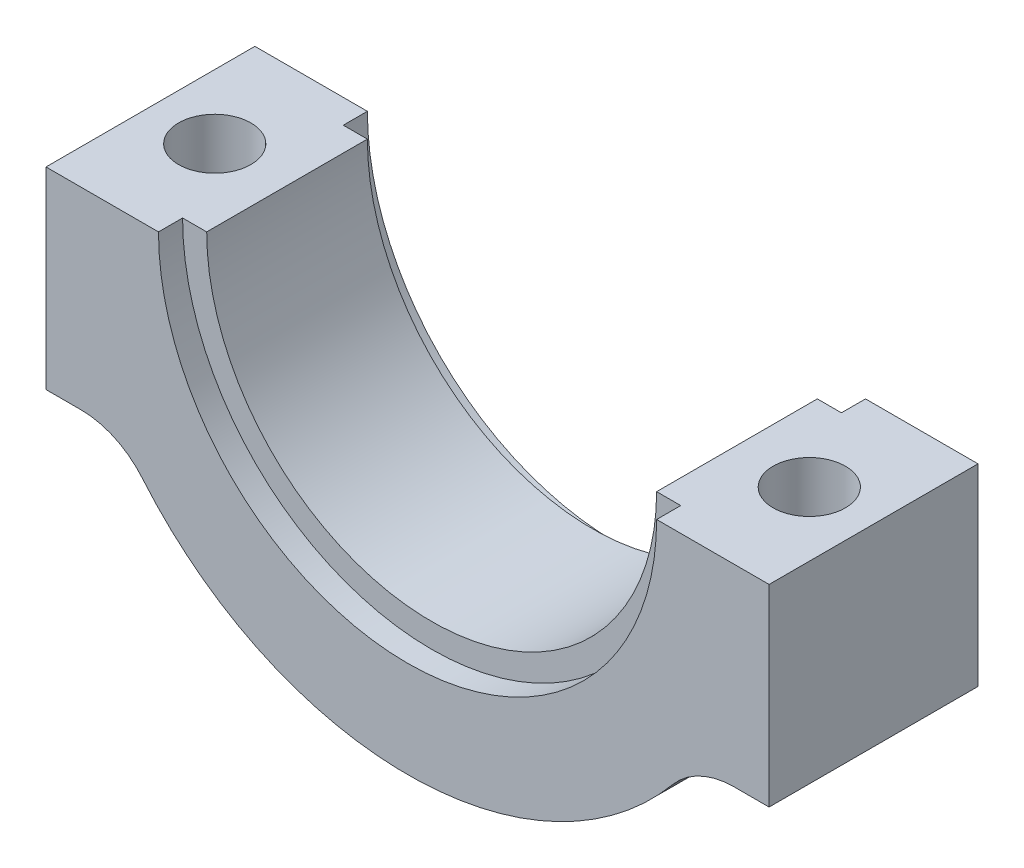
ISO-10303-21;
HEADER;
FILE_DESCRIPTION(('STEP AP214'),'2;1');
FILE_NAME('part.step','',(''),(''),'','','');
FILE_SCHEMA(('AUTOMOTIVE_DESIGN { 1 0 10303 214 1 1 1 1 }'));
ENDSEC;
DATA;
#1=APPLICATION_CONTEXT('core data for automotive mechanical design processes');
#2=APPLICATION_PROTOCOL_DEFINITION('international standard','automotive_design',2000,#1);
#3=PRODUCT_CONTEXT('',#1,'mechanical');
#4=PRODUCT('Part','Part','',(#3));
#5=PRODUCT_RELATED_PRODUCT_CATEGORY('part','',(#4));
#6=PRODUCT_DEFINITION_FORMATION('','',#4);
#7=PRODUCT_DEFINITION_CONTEXT('part definition',#1,'design');
#8=PRODUCT_DEFINITION('design','',#6,#7);
#9=PRODUCT_DEFINITION_SHAPE('','',#8);
#10=(LENGTH_UNIT() NAMED_UNIT(*) SI_UNIT(.MILLI.,.METRE.));
#11=(NAMED_UNIT(*) PLANE_ANGLE_UNIT() SI_UNIT($,.RADIAN.));
#12=(NAMED_UNIT(*) SI_UNIT($,.STERADIAN.) SOLID_ANGLE_UNIT());
#13=UNCERTAINTY_MEASURE_WITH_UNIT(LENGTH_MEASURE(1.E-05),#10,'distance_accuracy_value','');
#14=(GEOMETRIC_REPRESENTATION_CONTEXT(3) GLOBAL_UNCERTAINTY_ASSIGNED_CONTEXT((#13)) GLOBAL_UNIT_ASSIGNED_CONTEXT((#10,
#11,#12)) REPRESENTATION_CONTEXT('',''));
#15=CARTESIAN_POINT('',(0.,0.,0.));
#16=DIRECTION('',(0.,0.,1.));
#17=DIRECTION('',(1.,0.,0.));
#18=AXIS2_PLACEMENT_3D('',#15,#16,#17);
#19=CARTESIAN_POINT('',(-40.6571027005122,-34.,13.));
#20=DIRECTION('',(0.,0.,-1.));
#21=DIRECTION('',(-1.,0.,0.));
#22=AXIS2_PLACEMENT_3D('',#19,#20,#21);
#23=CYLINDRICAL_SURFACE('',#22,10.);
#24=DIRECTION('',(0.,0.,-1.));
#25=VECTOR('',#24,1.);
#26=CARTESIAN_POINT('',(-32.9859512475854,-27.5849056603774,13.));
#27=LINE('',#26,#25);
#28=CARTESIAN_POINT('',(-32.9859512475854,-27.5849056603774,-5.73475479974852));
#29=VERTEX_POINT('',#28);
#30=CARTESIAN_POINT('',(-32.9859512475854,-27.5849056603774,-13.));
#31=VERTEX_POINT('',#30);
#32=EDGE_CURVE('E193',#29,#31,#27,.T.);
#33=ORIENTED_EDGE('',*,*,#32,.F.);
#34=CARTESIAN_POINT('',(-32.9859512475854,-27.5849056603774,-5.73475479974852));
#35=CARTESIAN_POINT('',(-33.1306130932674,-27.4119293618595,-5.83600584331512));
#36=CARTESIAN_POINT('',(-33.2821591027048,-27.2425928465577,-5.93392719494627));
#37=CARTESIAN_POINT('',(-33.5993440803177,-26.9119347154642,-6.12123781025899));
#38=CARTESIAN_POINT('',(-33.7650090613763,-26.7506288005746,-6.21061065214667));
#39=CARTESIAN_POINT('',(-34.1119280376004,-26.4358697395075,-6.37938951398592));
#40=CARTESIAN_POINT('',(-34.2933206619334,-26.2825106258346,-6.45868759261752));
#41=CARTESIAN_POINT('',(-34.6698386747148,-25.9868930346017,-6.60386331383972));
#42=CARTESIAN_POINT('',(-34.8649532144519,-25.8446259710849,-6.66975140154596));
#43=CARTESIAN_POINT('',(-35.2187037793178,-25.6061039553941,-6.77141332626987));
#44=CARTESIAN_POINT('',(-35.3745304059622,-25.5071296205137,-6.81060892107759));
#45=CARTESIAN_POINT('',(-35.6930688560436,-25.3171007419695,-6.87884051703382));
#46=CARTESIAN_POINT('',(-35.855778982955,-25.22604426356,-6.90787900536525));
#47=CARTESIAN_POINT('',(-36.1867131477594,-25.0529136229983,-6.95459420154392));
#48=CARTESIAN_POINT('',(-36.3549139661041,-24.9708067446886,-6.97231352806404));
#49=CARTESIAN_POINT('',(-36.696385675352,-24.8158907428924,-6.99550547242811));
#50=CARTESIAN_POINT('',(-36.8696564395766,-24.7430813873398,-7.00097839599843));
#51=CARTESIAN_POINT('',(-37.2214601983275,-24.6067982069484,-6.99872516743415));
#52=CARTESIAN_POINT('',(-37.4000253428333,-24.5434087205774,-6.9908867722758));
#53=CARTESIAN_POINT('',(-37.7594149154626,-24.4271702152558,-6.96101984607776));
#54=CARTESIAN_POINT('',(-37.9402394728761,-24.3743218024576,-6.9389904993116));
#55=CARTESIAN_POINT('',(-38.3025250594597,-24.279348117569,-6.88019932115076));
#56=CARTESIAN_POINT('',(-38.4839865610824,-24.2372343128925,-6.84342184182186));
#57=CARTESIAN_POINT('',(-38.8454063672415,-24.1637537332521,-6.75492889420727));
#58=CARTESIAN_POINT('',(-39.0253650605597,-24.1323840890544,-6.70321742086251));
#59=CARTESIAN_POINT('',(-39.3299045894253,-24.0876404367327,-6.60221754415596));
#60=CARTESIAN_POINT('',(-39.4553479995582,-24.071686184018,-6.5566104598422));
#61=CARTESIAN_POINT('',(-39.7038759614562,-24.0447513838039,-6.45808923400032));
#62=CARTESIAN_POINT('',(-39.826960675982,-24.033770491928,-6.4051755987399));
#63=CARTESIAN_POINT('',(-40.069979944105,-24.0165086932862,-6.29230806443946));
#64=CARTESIAN_POINT('',(-40.1899186322987,-24.010221285258,-6.23236403743769));
#65=CARTESIAN_POINT('',(-40.4262841485862,-24.0019626171123,-6.10562043200864));
#66=CARTESIAN_POINT('',(-40.5427107098446,-23.9999916841304,-6.03882033437721));
#67=CARTESIAN_POINT('',(-40.6571027005122,-24.,-5.96871844183542));
#68=B_SPLINE_CURVE_WITH_KNOTS('',3,(#34,#35,#36,#37,#38,#39,#40,#41,#42,#43,#44,#45,#46,#47,#48,
#49,#50,#51,#52,#53,#54,#55,#56,#57,#58,#59,#60,#61,#62,#63,#64,#65,#66,#67),.UNSPECIFIED.,.F.,
.F.,(4,2,2,2,2,2,2,2,2,2,2,2,2,2,2,2,4),(0.,0.741583711127663,1.48456454702788,2.23493319059234,
2.98471511205514,3.55035896166155,4.11586420424848,4.67922746929971,5.24257667006354,
5.81069973657776,6.37885546294475,6.94761561066858,7.51622375204728,7.91921385871509,
8.32217605637311,8.72457904276722,9.12701252529948),.UNSPECIFIED.);
#69=CARTESIAN_POINT('',(-40.6571027005122,-24.,-5.96871844183542));
#70=VERTEX_POINT('',#69);
#71=EDGE_CURVE('E57',#29,#70,#68,.T.);
#72=ORIENTED_EDGE('',*,*,#71,.T.);
#73=DIRECTION('',(0.,0.,-1.));
#74=VECTOR('',#73,1.);
#75=CARTESIAN_POINT('',(-40.6571027005122,-24.,13.));
#76=LINE('',#75,#74);
#77=CARTESIAN_POINT('',(-40.6571027005122,-24.,-13.));
#78=VERTEX_POINT('',#77);
#79=EDGE_CURVE('E197',#70,#78,#76,.T.);
#80=ORIENTED_EDGE('',*,*,#79,.T.);
#81=CARTESIAN_POINT('',(-40.6571027005122,-34.,-13.));
#82=DIRECTION('',(0.,0.,-1.));
#83=DIRECTION('',(1.,0.,0.));
#84=AXIS2_PLACEMENT_3D('',#81,#82,#83);
#85=CIRCLE('',#84,10.);
#86=EDGE_CURVE('E273',#78,#31,#85,.T.);
#87=ORIENTED_EDGE('',*,*,#86,.T.);
#88=EDGE_LOOP('',(#33,#72,#80,#87));
#89=FACE_BOUND('',#88,.T.);
#90=ADVANCED_FACE('F37',(#89),#23,.F.);
#91=CARTESIAN_POINT('',(40.6571027005122,-34.,13.));
#92=DIRECTION('',(0.,0.,-1.));
#93=DIRECTION('',(-1.,0.,0.));
#94=AXIS2_PLACEMENT_3D('',#91,#92,#93);
#95=CYLINDRICAL_SURFACE('',#94,10.);
#96=DIRECTION('',(0.,0.,-1.));
#97=VECTOR('',#96,1.);
#98=CARTESIAN_POINT('',(40.6571027005122,-24.,13.));
#99=LINE('',#98,#97);
#100=CARTESIAN_POINT('',(40.6571027005122,-24.,-5.96871844183538));
#101=VERTEX_POINT('',#100);
#102=CARTESIAN_POINT('',(40.6571027005122,-24.,-13.));
#103=VERTEX_POINT('',#102);
#104=EDGE_CURVE('E186',#101,#103,#99,.T.);
#105=ORIENTED_EDGE('',*,*,#104,.F.);
#106=CARTESIAN_POINT('',(40.6571027005122,-24.,-5.96871844183539));
#107=CARTESIAN_POINT('',(40.5134366646464,-23.9999774815993,-6.05677774743217));
#108=CARTESIAN_POINT('',(40.3665407108172,-24.0030951834329,-6.13961459206069));
#109=CARTESIAN_POINT('',(40.0673823612371,-24.0162866326034,-6.29439658122048));
#110=CARTESIAN_POINT('',(39.9151187845807,-24.0263619198241,-6.36633931031872));
#111=CARTESIAN_POINT('',(39.6066387507888,-24.0541217549825,-6.49873720380914));
#112=CARTESIAN_POINT('',(39.4504292549536,-24.0717936781745,-6.55921118869458));
#113=CARTESIAN_POINT('',(39.1351082499968,-24.115221399825,-6.66851899427432));
#114=CARTESIAN_POINT('',(38.9759971047794,-24.1409761910658,-6.71735426395222));
#115=CARTESIAN_POINT('',(38.6558642655714,-24.2009378759578,-6.80335515185163));
#116=CARTESIAN_POINT('',(38.4948393588539,-24.2351617552562,-6.84049697324665));
#117=CARTESIAN_POINT('',(38.1725495283507,-24.3121495800016,-6.90304829444939));
#118=CARTESIAN_POINT('',(38.0112845945001,-24.3549138941881,-6.92845728752661));
#119=CARTESIAN_POINT('',(37.6900311566589,-24.4488502816723,-6.96778410169093));
#120=CARTESIAN_POINT('',(37.5300413348367,-24.5000120279347,-6.98171591213612));
#121=CARTESIAN_POINT('',(37.2123459665914,-24.6105410011828,-6.99858669885626));
#122=CARTESIAN_POINT('',(37.0546404032745,-24.6699081674489,-7.00152575647232));
#123=CARTESIAN_POINT('',(36.7429171064265,-24.7963387155715,-6.99701049353366));
#124=CARTESIAN_POINT('',(36.5888920024561,-24.8633848238845,-6.98957909531888));
#125=CARTESIAN_POINT('',(36.2850008347643,-25.0048440593042,-6.96505750561452));
#126=CARTESIAN_POINT('',(36.1351362823831,-25.0792598197762,-6.94796385120747));
#127=CARTESIAN_POINT('',(35.8398768070319,-25.23516732417,-6.9048130629218));
#128=CARTESIAN_POINT('',(35.694497061923,-25.3166801435765,-6.8787285005583));
#129=CARTESIAN_POINT('',(35.4092176509542,-25.4860561230626,-6.8184073876636));
#130=CARTESIAN_POINT('',(35.2693192300017,-25.5739207129993,-6.78416899760659));
#131=CARTESIAN_POINT('',(34.9240140295484,-25.8027970400703,-6.68857256320868));
#132=CARTESIAN_POINT('',(34.7224630054762,-25.9476429127792,-6.6223801020915));
#133=CARTESIAN_POINT('',(34.3337309505764,-26.2491562861442,-6.47566486242957));
#134=CARTESIAN_POINT('',(34.1465643376447,-26.4058353436112,-6.39512796745435));
#135=CARTESIAN_POINT('',(33.7885512268053,-26.728097306123,-6.2230010204157));
#136=CARTESIAN_POINT('',(33.6175872701046,-26.8935999127131,-6.13150350924224));
#137=CARTESIAN_POINT('',(33.2906601112954,-27.2331029310045,-5.93941381789456));
#138=CARTESIAN_POINT('',(33.1346650495444,-27.4070840500422,-5.83884187927741));
#139=CARTESIAN_POINT('',(32.9859512475854,-27.5849056603774,-5.73475479974854));
#140=B_SPLINE_CURVE_WITH_KNOTS('',3,(#106,#107,#108,#109,#110,#111,#112,#113,#114,#115,#116,
#117,#118,#119,#120,#121,#122,#123,#124,#125,#126,#127,#128,#129,#130,#131,#132,#133,#134,#135,
#136,#137,#138,#139),.UNSPECIFIED.,.F.,.F.,(4,2,2,2,2,2,2,2,2,2,2,2,2,2,2,2,4),(0.,
0.505416484689542,1.01094486628257,1.51563634555385,2.02026495945541,2.52591398042446,
3.03158483788661,3.53663842529542,4.0416882755416,4.54562355520787,5.04973955806353,
5.55540727788137,6.06118918596972,6.8305555561635,7.60068328975448,8.36471485396873,
9.1270824111401),.UNSPECIFIED.);
#141=CARTESIAN_POINT('',(32.9859512475854,-27.5849056603774,-5.73475479974854));
#142=VERTEX_POINT('',#141);
#143=EDGE_CURVE('E64',#101,#142,#140,.T.);
#144=ORIENTED_EDGE('',*,*,#143,.T.);
#145=DIRECTION('',(0.,0.,-1.));
#146=VECTOR('',#145,1.);
#147=CARTESIAN_POINT('',(32.9859512475854,-27.5849056603774,13.));
#148=LINE('',#147,#146);
#149=CARTESIAN_POINT('',(32.9859512475854,-27.5849056603774,-13.));
#150=VERTEX_POINT('',#149);
#151=EDGE_CURVE('E185',#142,#150,#148,.T.);
#152=ORIENTED_EDGE('',*,*,#151,.T.);
#153=CARTESIAN_POINT('',(40.6571027005122,-34.,-13.));
#154=DIRECTION('',(0.,0.,-1.));
#155=DIRECTION('',(1.,0.,0.));
#156=AXIS2_PLACEMENT_3D('',#153,#154,#155);
#157=CIRCLE('',#156,10.);
#158=EDGE_CURVE('E279',#150,#103,#157,.T.);
#159=ORIENTED_EDGE('',*,*,#158,.T.);
#160=EDGE_LOOP('',(#105,#144,#152,#159));
#161=FACE_BOUND('',#160,.T.);
#162=ADVANCED_FACE('F380',(#161),#95,.F.);
#163=CARTESIAN_POINT('',(28.,0.,13.));
#164=DIRECTION('',(0.,-1.,0.));
#165=DIRECTION('',(1.,0.,0.));
#166=AXIS2_PLACEMENT_3D('',#163,#164,#165);
#167=PLANE('',#166);
#168=CARTESIAN_POINT('',(37.,0.,0.));
#169=DIRECTION('',(0.,-1.,0.));
#170=DIRECTION('',(1.,0.,0.));
#171=AXIS2_PLACEMENT_3D('',#168,#169,#170);
#172=CIRCLE('',#171,4.5);
#173=CARTESIAN_POINT('',(41.5,0.,0.));
#174=VERTEX_POINT('',#173);
#175=EDGE_CURVE('E547',#174,#174,#172,.T.);
#176=ORIENTED_EDGE('',*,*,#175,.T.);
#177=EDGE_LOOP('',(#176));
#178=FACE_BOUND('',#177,.T.);
#179=DIRECTION('',(1.,0.,0.));
#180=VECTOR('',#179,1.);
#181=CARTESIAN_POINT('',(28.,0.,10.));
#182=LINE('',#181,#180);
#183=CARTESIAN_POINT('',(28.,0.,10.));
#184=VERTEX_POINT('',#183);
#185=CARTESIAN_POINT('',(31.,0.,10.));
#186=VERTEX_POINT('',#185);
#187=EDGE_CURVE('E231',#184,#186,#182,.T.);
#188=ORIENTED_EDGE('',*,*,#187,.T.);
#189=DIRECTION('',(0.,0.,1.));
#190=VECTOR('',#189,1.);
#191=CARTESIAN_POINT('',(31.,0.,10.));
#192=LINE('',#191,#190);
#193=CARTESIAN_POINT('',(31.,0.,13.));
#194=VERTEX_POINT('',#193);
#195=EDGE_CURVE('E316',#186,#194,#192,.T.);
#196=ORIENTED_EDGE('',*,*,#195,.T.);
#197=DIRECTION('',(-1.,0.,0.));
#198=VECTOR('',#197,1.);
#199=CARTESIAN_POINT('',(28.,0.,13.));
#200=LINE('',#199,#198);
#201=CARTESIAN_POINT('',(45.,0.,13.));
#202=VERTEX_POINT('',#201);
#203=EDGE_CURVE('E247',#202,#194,#200,.T.);
#204=ORIENTED_EDGE('',*,*,#203,.F.);
#205=DIRECTION('',(0.,0.,-1.));
#206=VECTOR('',#205,1.);
#207=CARTESIAN_POINT('',(45.,0.,13.));
#208=LINE('',#207,#206);
#209=CARTESIAN_POINT('',(45.,0.,-13.));
#210=VERTEX_POINT('',#209);
#211=EDGE_CURVE('E265',#202,#210,#208,.T.);
#212=ORIENTED_EDGE('',*,*,#211,.T.);
#213=DIRECTION('',(-1.,0.,0.));
#214=VECTOR('',#213,1.);
#215=CARTESIAN_POINT('',(28.,0.,-13.));
#216=LINE('',#215,#214);
#217=CARTESIAN_POINT('',(31.,0.,-13.));
#218=VERTEX_POINT('',#217);
#219=EDGE_CURVE('E239',#210,#218,#216,.T.);
#220=ORIENTED_EDGE('',*,*,#219,.T.);
#221=DIRECTION('',(0.,0.,-1.));
#222=VECTOR('',#221,1.);
#223=CARTESIAN_POINT('',(31.,0.,-10.));
#224=LINE('',#223,#222);
#225=CARTESIAN_POINT('',(31.,0.,-10.));
#226=VERTEX_POINT('',#225);
#227=EDGE_CURVE('E235',#226,#218,#224,.T.);
#228=ORIENTED_EDGE('',*,*,#227,.F.);
#229=DIRECTION('',(-1.,0.,0.));
#230=VECTOR('',#229,1.);
#231=CARTESIAN_POINT('',(28.,0.,-10.));
#232=LINE('',#231,#230);
#233=CARTESIAN_POINT('',(28.,0.,-10.));
#234=VERTEX_POINT('',#233);
#235=EDGE_CURVE('E233',#226,#234,#232,.T.);
#236=ORIENTED_EDGE('',*,*,#235,.T.);
#237=DIRECTION('',(0.,0.,-1.));
#238=VECTOR('',#237,1.);
#239=CARTESIAN_POINT('',(28.,0.,13.));
#240=LINE('',#239,#238);
#241=EDGE_CURVE('E209',#184,#234,#240,.T.);
#242=ORIENTED_EDGE('',*,*,#241,.F.);
#243=EDGE_LOOP('',(#188,#196,#204,#212,#220,#228,#236,#242));
#244=FACE_BOUND('',#243,.T.);
#245=ADVANCED_FACE('F39',(#178,#244),#167,.F.);
#246=CARTESIAN_POINT('',(-28.,0.,13.));
#247=DIRECTION('',(0.,-1.,0.));
#248=DIRECTION('',(1.,0.,0.));
#249=AXIS2_PLACEMENT_3D('',#246,#247,#248);
#250=PLANE('',#249);
#251=CARTESIAN_POINT('',(-37.,0.,0.));
#252=DIRECTION('',(0.,-1.,0.));
#253=DIRECTION('',(1.,0.,0.));
#254=AXIS2_PLACEMENT_3D('',#251,#252,#253);
#255=CIRCLE('',#254,4.5);
#256=CARTESIAN_POINT('',(-32.5,0.,0.));
#257=VERTEX_POINT('',#256);
#258=EDGE_CURVE('E540',#257,#257,#255,.T.);
#259=ORIENTED_EDGE('',*,*,#258,.T.);
#260=EDGE_LOOP('',(#259));
#261=FACE_BOUND('',#260,.T.);
#262=DIRECTION('',(-1.,0.,0.));
#263=VECTOR('',#262,1.);
#264=CARTESIAN_POINT('',(-28.,0.,13.));
#265=LINE('',#264,#263);
#266=CARTESIAN_POINT('',(-31.,0.,13.));
#267=VERTEX_POINT('',#266);
#268=CARTESIAN_POINT('',(-45.,0.,13.));
#269=VERTEX_POINT('',#268);
#270=EDGE_CURVE('E250',#267,#269,#265,.T.);
#271=ORIENTED_EDGE('',*,*,#270,.F.);
#272=DIRECTION('',(0.,0.,1.));
#273=VECTOR('',#272,1.);
#274=CARTESIAN_POINT('',(-31.,0.,10.));
#275=LINE('',#274,#273);
#276=CARTESIAN_POINT('',(-31.,0.,10.));
#277=VERTEX_POINT('',#276);
#278=EDGE_CURVE('E318',#267,#277,#275,.F.);
#279=ORIENTED_EDGE('',*,*,#278,.T.);
#280=DIRECTION('',(1.,0.,0.));
#281=VECTOR('',#280,1.);
#282=CARTESIAN_POINT('',(-28.,0.,10.));
#283=LINE('',#282,#281);
#284=CARTESIAN_POINT('',(-28.,0.,10.));
#285=VERTEX_POINT('',#284);
#286=EDGE_CURVE('E314',#277,#285,#283,.T.);
#287=ORIENTED_EDGE('',*,*,#286,.T.);
#288=DIRECTION('',(0.,0.,-1.));
#289=VECTOR('',#288,1.);
#290=CARTESIAN_POINT('',(-28.,0.,13.));
#291=LINE('',#290,#289);
#292=CARTESIAN_POINT('',(-28.,0.,-10.));
#293=VERTEX_POINT('',#292);
#294=EDGE_CURVE('E207',#285,#293,#291,.T.);
#295=ORIENTED_EDGE('',*,*,#294,.T.);
#296=DIRECTION('',(-1.,0.,0.));
#297=VECTOR('',#296,1.);
#298=CARTESIAN_POINT('',(-28.,0.,-10.));
#299=LINE('',#298,#297);
#300=CARTESIAN_POINT('',(-31.,0.,-10.));
#301=VERTEX_POINT('',#300);
#302=EDGE_CURVE('E213',#293,#301,#299,.T.);
#303=ORIENTED_EDGE('',*,*,#302,.T.);
#304=DIRECTION('',(0.,0.,-1.));
#305=VECTOR('',#304,1.);
#306=CARTESIAN_POINT('',(-31.,0.,-10.));
#307=LINE('',#306,#305);
#308=CARTESIAN_POINT('',(-31.,0.,-13.));
#309=VERTEX_POINT('',#308);
#310=EDGE_CURVE('E303',#309,#301,#307,.F.);
#311=ORIENTED_EDGE('',*,*,#310,.F.);
#312=DIRECTION('',(-1.,0.,0.));
#313=VECTOR('',#312,1.);
#314=CARTESIAN_POINT('',(-28.,0.,-13.));
#315=LINE('',#314,#313);
#316=CARTESIAN_POINT('',(-45.,0.,-13.));
#317=VERTEX_POINT('',#316);
#318=EDGE_CURVE('E242',#309,#317,#315,.T.);
#319=ORIENTED_EDGE('',*,*,#318,.T.);
#320=DIRECTION('',(0.,0.,-1.));
#321=VECTOR('',#320,1.);
#322=CARTESIAN_POINT('',(-45.,0.,13.));
#323=LINE('',#322,#321);
#324=EDGE_CURVE('E204',#269,#317,#323,.T.);
#325=ORIENTED_EDGE('',*,*,#324,.F.);
#326=EDGE_LOOP('',(#271,#279,#287,#295,#303,#311,#319,#325));
#327=FACE_BOUND('',#326,.T.);
#328=ADVANCED_FACE('F306',(#261,#327),#250,.F.);
#329=CARTESIAN_POINT('',(0.,0.,13.));
#330=DIRECTION('',(0.,0.,-1.));
#331=DIRECTION('',(-1.,0.,0.));
#332=AXIS2_PLACEMENT_3D('',#329,#330,#331);
#333=CYLINDRICAL_SURFACE('',#332,28.);
#334=ORIENTED_EDGE('',*,*,#294,.F.);
#335=CARTESIAN_POINT('',(0.,0.,10.));
#336=DIRECTION('',(0.,0.,-1.));
#337=DIRECTION('',(-1.,0.,0.));
#338=AXIS2_PLACEMENT_3D('',#335,#336,#337);
#339=CIRCLE('',#338,28.);
#340=EDGE_CURVE('E170',#285,#184,#339,.F.);
#341=ORIENTED_EDGE('',*,*,#340,.T.);
#342=ORIENTED_EDGE('',*,*,#241,.T.);
#343=CARTESIAN_POINT('',(0.,0.,-10.));
#344=DIRECTION('',(0.,0.,1.));
#345=DIRECTION('',(1.,0.,0.));
#346=AXIS2_PLACEMENT_3D('',#343,#344,#345);
#347=CIRCLE('',#346,28.);
#348=EDGE_CURVE('E240',#234,#293,#347,.F.);
#349=ORIENTED_EDGE('',*,*,#348,.T.);
#350=EDGE_LOOP('',(#334,#341,#342,#349));
#351=FACE_BOUND('',#350,.T.);
#352=ADVANCED_FACE('F222',(#351),#333,.F.);
#353=CARTESIAN_POINT('',(-45.,0.,13.));
#354=DIRECTION('',(1.,0.,0.));
#355=DIRECTION('',(0.,0.,-1.));
#356=AXIS2_PLACEMENT_3D('',#353,#354,#355);
#357=PLANE('',#356);
#358=DIRECTION('',(0.,-1.,0.));
#359=VECTOR('',#358,1.);
#360=CARTESIAN_POINT('',(-45.,0.,-13.));
#361=LINE('',#360,#359);
#362=CARTESIAN_POINT('',(-45.,-24.,-13.));
#363=VERTEX_POINT('',#362);
#364=EDGE_CURVE('E268',#317,#363,#361,.T.);
#365=ORIENTED_EDGE('',*,*,#364,.T.);
#366=DIRECTION('',(0.,0.,-1.));
#367=VECTOR('',#366,1.);
#368=CARTESIAN_POINT('',(-45.,-24.,13.));
#369=LINE('',#368,#367);
#370=CARTESIAN_POINT('',(-45.,-24.,13.));
#371=VERTEX_POINT('',#370);
#372=EDGE_CURVE('E201',#371,#363,#369,.T.);
#373=ORIENTED_EDGE('',*,*,#372,.F.);
#374=DIRECTION('',(0.,-1.,0.));
#375=VECTOR('',#374,1.);
#376=CARTESIAN_POINT('',(-45.,0.,13.));
#377=LINE('',#376,#375);
#378=EDGE_CURVE('E253',#269,#371,#377,.T.);
#379=ORIENTED_EDGE('',*,*,#378,.F.);
#380=ORIENTED_EDGE('',*,*,#324,.T.);
#381=EDGE_LOOP('',(#365,#373,#379,#380));
#382=FACE_BOUND('',#381,.T.);
#383=ADVANCED_FACE('F414',(#382),#357,.F.);
#384=CARTESIAN_POINT('',(-45.,-24.,13.));
#385=DIRECTION('',(0.,1.,0.));
#386=DIRECTION('',(-1.,0.,0.));
#387=AXIS2_PLACEMENT_3D('',#384,#385,#386);
#388=PLANE('',#387);
#389=ORIENTED_EDGE('',*,*,#79,.F.);
#390=CARTESIAN_POINT('',(-37.,-24.,0.));
#391=DIRECTION('',(0.,1.,0.));
#392=DIRECTION('',(-1.,0.,0.));
#393=AXIS2_PLACEMENT_3D('',#390,#391,#392);
#394=CIRCLE('',#393,7.);
#395=CARTESIAN_POINT('',(-40.6571027005122,-24.,5.96871844183542));
#396=VERTEX_POINT('',#395);
#397=EDGE_CURVE('E324',#70,#396,#394,.T.);
#398=ORIENTED_EDGE('',*,*,#397,.T.);
#399=CARTESIAN_POINT('',(-40.6571027005122,-24.,13.));
#400=VERTEX_POINT('',#399);
#401=EDGE_CURVE('E198',#400,#396,#76,.T.);
#402=ORIENTED_EDGE('',*,*,#401,.F.);
#403=DIRECTION('',(1.,0.,0.));
#404=VECTOR('',#403,1.);
#405=CARTESIAN_POINT('',(-45.,-24.,13.));
#406=LINE('',#405,#404);
#407=EDGE_CURVE('E255',#371,#400,#406,.T.);
#408=ORIENTED_EDGE('',*,*,#407,.F.);
#409=ORIENTED_EDGE('',*,*,#372,.T.);
#410=DIRECTION('',(1.,0.,0.));
#411=VECTOR('',#410,1.);
#412=CARTESIAN_POINT('',(-45.,-24.,-13.));
#413=LINE('',#412,#411);
#414=EDGE_CURVE('E270',#363,#78,#413,.T.);
#415=ORIENTED_EDGE('',*,*,#414,.T.);
#416=EDGE_LOOP('',(#389,#398,#402,#408,#409,#415));
#417=FACE_BOUND('',#416,.T.);
#418=ADVANCED_FACE('F390',(#417),#388,.F.);
#419=ORIENTED_EDGE('',*,*,#401,.T.);
#420=CARTESIAN_POINT('',(-40.6571027005122,-24.,5.96871844183542));
#421=CARTESIAN_POINT('',(-40.5134366646464,-23.9999774815993,6.05677774743221));
#422=CARTESIAN_POINT('',(-40.3665407108172,-24.0030951834329,6.13961459206072));
#423=CARTESIAN_POINT('',(-40.0673823612371,-24.0162866326034,6.29439658122051));
#424=CARTESIAN_POINT('',(-39.9151187845807,-24.0263619198241,6.36633931031875));
#425=CARTESIAN_POINT('',(-39.6066387507888,-24.0541217549825,6.49873720380917));
#426=CARTESIAN_POINT('',(-39.4504292549536,-24.0717936781745,6.55921118869461));
#427=CARTESIAN_POINT('',(-39.1351082499968,-24.115221399825,6.66851899427435));
#428=CARTESIAN_POINT('',(-38.9759971047794,-24.1409761910658,6.71735426395224));
#429=CARTESIAN_POINT('',(-38.6558642655714,-24.2009378759578,6.80335515185165));
#430=CARTESIAN_POINT('',(-38.4948393588539,-24.2351617552562,6.84049697324667));
#431=CARTESIAN_POINT('',(-38.1725495283506,-24.3121495800016,6.90304829444941));
#432=CARTESIAN_POINT('',(-38.0112845945001,-24.3549138941881,6.92845728752663));
#433=CARTESIAN_POINT('',(-37.6900311566589,-24.4488502816723,6.96778410169094));
#434=CARTESIAN_POINT('',(-37.5300413348367,-24.5000120279347,6.98171591213614));
#435=CARTESIAN_POINT('',(-37.2123459665914,-24.6105410011828,6.99858669885627));
#436=CARTESIAN_POINT('',(-37.0546404032745,-24.6699081674489,7.00152575647233));
#437=CARTESIAN_POINT('',(-36.7429171064265,-24.7963387155715,6.99701049353366));
#438=CARTESIAN_POINT('',(-36.5888920024561,-24.8633848238845,6.98957909531889));
#439=CARTESIAN_POINT('',(-36.2850008347643,-25.0048440593042,6.96505750561453));
#440=CARTESIAN_POINT('',(-36.1351362823831,-25.0792598197762,6.94796385120747));
#441=CARTESIAN_POINT('',(-35.8398768070319,-25.23516732417,6.9048130629218));
#442=CARTESIAN_POINT('',(-35.694497061923,-25.3166801435765,6.8787285005583));
#443=CARTESIAN_POINT('',(-35.4092176509542,-25.4860561230626,6.8184073876636));
#444=CARTESIAN_POINT('',(-35.2693192300017,-25.5739207129993,6.78416899760659));
#445=CARTESIAN_POINT('',(-34.9240140295484,-25.8027970400703,6.68857256320867));
#446=CARTESIAN_POINT('',(-34.7224630054761,-25.9476429127792,6.62238010209149));
#447=CARTESIAN_POINT('',(-34.3337309505763,-26.2491562861443,6.47566486242956));
#448=CARTESIAN_POINT('',(-34.1465643376447,-26.4058353436112,6.39512796745434));
#449=CARTESIAN_POINT('',(-33.7885512268053,-26.728097306123,6.22300102041568));
#450=CARTESIAN_POINT('',(-33.6175872701046,-26.8935999127131,6.13150350924222));
#451=CARTESIAN_POINT('',(-33.2906601112954,-27.2331029310045,5.93941381789454));
#452=CARTESIAN_POINT('',(-33.1346650495444,-27.4070840500422,5.83884187927739));
#453=CARTESIAN_POINT('',(-32.9859512475854,-27.5849056603774,5.73475479974852));
#454=B_SPLINE_CURVE_WITH_KNOTS('',3,(#420,#421,#422,#423,#424,#425,#426,#427,#428,#429,#430,
#431,#432,#433,#434,#435,#436,#437,#438,#439,#440,#441,#442,#443,#444,#445,#446,#447,#448,#449,
#450,#451,#452,#453),.UNSPECIFIED.,.F.,.F.,(4,2,2,2,2,2,2,2,2,2,2,2,2,2,2,2,4),(0.,
0.505416484689548,1.01094486628257,1.51563634555385,2.02026495945542,2.52591398042445,
3.03158483788662,3.53663842529543,4.0416882755416,4.54562355520788,5.04973955806354,
5.55540727788137,6.06118918596972,6.83055555616351,7.60068328975448,8.36471485396873,
9.12708241114009),.UNSPECIFIED.);
#455=CARTESIAN_POINT('',(-32.9859512475854,-27.5849056603773,5.73475479974852));
#456=VERTEX_POINT('',#455);
#457=EDGE_CURVE('E332',#396,#456,#454,.T.);
#458=ORIENTED_EDGE('',*,*,#457,.T.);
#459=CARTESIAN_POINT('',(-32.9859512475854,-27.5849056603774,13.));
#460=VERTEX_POINT('',#459);
#461=EDGE_CURVE('E194',#460,#456,#27,.T.);
#462=ORIENTED_EDGE('',*,*,#461,.F.);
#463=CARTESIAN_POINT('',(-40.6571027005122,-34.,13.));
#464=DIRECTION('',(0.,0.,-1.));
#465=DIRECTION('',(1.,0.,0.));
#466=AXIS2_PLACEMENT_3D('',#463,#464,#465);
#467=CIRCLE('',#466,10.);
#468=EDGE_CURVE('E257',#400,#460,#467,.T.);
#469=ORIENTED_EDGE('',*,*,#468,.F.);
#470=EDGE_LOOP('',(#419,#458,#462,#469));
#471=FACE_BOUND('',#470,.T.);
#472=ADVANCED_FACE('F337',(#471),#23,.F.);
#473=CARTESIAN_POINT('',(0.,0.,13.));
#474=DIRECTION('',(0.,0.,-1.));
#475=DIRECTION('',(-1.,0.,0.));
#476=AXIS2_PLACEMENT_3D('',#473,#474,#475);
#477=CYLINDRICAL_SURFACE('',#476,43.);
#478=ORIENTED_EDGE('',*,*,#461,.T.);
#479=CARTESIAN_POINT('',(-32.9859512475854,-27.5849056603773,5.73475479974852));
#480=CARTESIAN_POINT('',(-32.8474531919529,-27.750548092411,5.63778840068112));
#481=CARTESIAN_POINT('',(-32.7096111585567,-27.9128174277139,5.53384827227523));
#482=CARTESIAN_POINT('',(-32.4365170229078,-28.2296974927222,5.31091794791791));
#483=CARTESIAN_POINT('',(-32.3012708062913,-28.3842918482744,5.19189735005994));
#484=CARTESIAN_POINT('',(-32.0339601073526,-28.6856482968111,4.93688542580783));
#485=CARTESIAN_POINT('',(-31.9019381763505,-28.832321808612,4.80074331527971));
#486=CARTESIAN_POINT('',(-31.6446311220233,-29.1144945867028,4.51192474939078));
#487=CARTESIAN_POINT('',(-31.5193403829263,-29.2500032197507,4.35926240763987));
#488=CARTESIAN_POINT('',(-31.2212493520205,-29.5685738219864,3.96145584683396));
#489=CARTESIAN_POINT('',(-31.0535165934913,-29.744369873077,3.70636614844758));
#490=CARTESIAN_POINT('',(-30.8233685688212,-29.9821987871242,3.29752770254627));
#491=CARTESIAN_POINT('',(-30.7502904297294,-30.0571019226913,3.15703515536167));
#492=CARTESIAN_POINT('',(-30.612337072829,-30.197590392773,2.8676487701598));
#493=CARTESIAN_POINT('',(-30.5474576935,-30.2631804565163,2.71875925022957));
#494=CARTESIAN_POINT('',(-30.4264182220191,-30.3848735699734,2.41155211592392));
#495=CARTESIAN_POINT('',(-30.3703623757564,-30.4408638055047,2.25314851549862));
#496=CARTESIAN_POINT('',(-30.2690261492946,-30.5416300702852,1.92944171245802));
#497=CARTESIAN_POINT('',(-30.2237460697668,-30.5864057866224,1.76413831747207));
#498=CARTESIAN_POINT('',(-30.1450336176293,-30.6639855513205,1.42801343190492));
#499=CARTESIAN_POINT('',(-30.1115988133842,-30.6967920567999,1.25719308172712));
#500=CARTESIAN_POINT('',(-30.0574157341713,-30.7498489286325,0.911641033818414));
#501=CARTESIAN_POINT('',(-30.0366651073387,-30.7701016226883,0.736910067415108));
#502=CARTESIAN_POINT('',(-30.0104891960232,-30.795629697728,0.41146918872992));
#503=CARTESIAN_POINT('',(-30.0032474676061,-30.8026808595324,0.261039980779511));
#504=CARTESIAN_POINT('',(-29.9984957652631,-30.8073086635658,-0.0401158251448763));
#505=CARTESIAN_POINT('',(-30.0009851210321,-30.8048859583819,-0.190842401920396));
#506=CARTESIAN_POINT('',(-30.0156447853254,-30.7906019825746,-0.491331200826267));
#507=CARTESIAN_POINT('',(-30.0278126319849,-30.7787431121766,-0.641093658429853));
#508=CARTESIAN_POINT('',(-30.0615856252664,-30.7457578373392,-0.93851362018482));
#509=CARTESIAN_POINT('',(-30.0831907574376,-30.7246314470907,-1.08617112755907));
#510=CARTESIAN_POINT('',(-30.1339127098711,-30.6748836578912,-1.36980885182538));
#511=CARTESIAN_POINT('',(-30.1625208409591,-30.6467683678315,-1.50596945112964));
#512=CARTESIAN_POINT('',(-30.2272838379384,-30.5828934868968,-1.77466819123528));
#513=CARTESIAN_POINT('',(-30.2634410835584,-30.5471314854416,-1.90720517481854));
#514=CARTESIAN_POINT('',(-30.3823824341559,-30.42898877561,-2.29806475751186));
#515=CARTESIAN_POINT('',(-30.4757064900367,-30.3356831721065,-2.55001786405963));
#516=CARTESIAN_POINT('',(-30.6944203063638,-30.114426275885,-3.05309665879128));
#517=CARTESIAN_POINT('',(-30.8218766126408,-29.9841865640942,-3.30229016927152));
#518=CARTESIAN_POINT('',(-31.0978743806406,-29.6978411890258,-3.77355499002644));
#519=CARTESIAN_POINT('',(-31.2464762865192,-29.5416611542436,-3.99554503179422));
#520=CARTESIAN_POINT('',(-31.5229364070497,-29.2461222769569,-4.36372373645617));
#521=CARTESIAN_POINT('',(-31.6478181815616,-29.1110251743901,-4.51566539153055));
#522=CARTESIAN_POINT('',(-31.9042321347213,-28.8297799686155,-4.80315145420932));
#523=CARTESIAN_POINT('',(-32.0357705751983,-28.6836213935234,-4.93867999986676));
#524=CARTESIAN_POINT('',(-32.3023808248863,-28.3830262887555,-5.19288862812101));
#525=CARTESIAN_POINT('',(-32.4374202937392,-28.2286570924271,-5.31168321647336));
#526=CARTESIAN_POINT('',(-32.7100772273995,-27.9122688464982,-5.53420081368905));
#527=CARTESIAN_POINT('',(-32.8476885711584,-27.7502668369003,-5.63795546574682));
#528=CARTESIAN_POINT('',(-32.9859512475854,-27.5849056603774,-5.73475479974852));
#529=B_SPLINE_CURVE_WITH_KNOTS('',3,(#479,#480,#481,#482,#483,#484,#485,#486,#487,#488,#489,
#490,#491,#492,#493,#494,#495,#496,#497,#498,#499,#500,#501,#502,#503,#504,#505,#506,#507,#508,
#509,#510,#511,#512,#513,#514,#515,#516,#517,#518,#519,#520,#521,#522,#523,#524,#525,#526,#527,
#528),.UNSPECIFIED.,.F.,.F.,(4,2,2,2,2,2,2,2,2,2,2,2,2,2,2,2,2,2,2,2,2,2,2,2,4),(0.,
0.710102527655613,1.42166008940364,2.13999214769074,2.85771529240051,3.90989067750635,
4.43492450766505,4.95969076187805,5.49025443402346,6.02083290851357,6.55130240099081,
7.08167350543606,7.53338699417158,7.98506936813101,8.43663688684055,8.88820371408487,
9.31356471917083,9.73906001500627,10.5888810018006,11.5117399066515,12.4372918466052,
13.1521908489744,13.867775321631,14.5781968908026,15.2871013750757),.UNSPECIFIED.);
#530=EDGE_CURVE('E12',#456,#29,#529,.T.);
#531=ORIENTED_EDGE('',*,*,#530,.T.);
#532=ORIENTED_EDGE('',*,*,#32,.T.);
#533=CARTESIAN_POINT('',(0.,0.,-13.));
#534=DIRECTION('',(0.,0.,1.));
#535=DIRECTION('',(1.,0.,0.));
#536=AXIS2_PLACEMENT_3D('',#533,#534,#535);
#537=CIRCLE('',#536,43.);
#538=EDGE_CURVE('E276',#31,#150,#537,.T.);
#539=ORIENTED_EDGE('',*,*,#538,.T.);
#540=ORIENTED_EDGE('',*,*,#151,.F.);
#541=CARTESIAN_POINT('',(32.9859512475854,-27.5849056603773,-5.73475479974855));
#542=CARTESIAN_POINT('',(32.847453191953,-27.750548092411,-5.63778840068114));
#543=CARTESIAN_POINT('',(32.7096111585567,-27.9128174277139,-5.53384827227526));
#544=CARTESIAN_POINT('',(32.4365170229078,-28.2296974927222,-5.31091794791794));
#545=CARTESIAN_POINT('',(32.3012708062913,-28.3842918482744,-5.19189735005997));
#546=CARTESIAN_POINT('',(32.0339601073526,-28.6856482968111,-4.93688542580787));
#547=CARTESIAN_POINT('',(31.9019381763505,-28.832321808612,-4.80074331527975));
#548=CARTESIAN_POINT('',(31.6446311220232,-29.1144945867028,-4.51192474939081));
#549=CARTESIAN_POINT('',(31.5193403829263,-29.2500032197507,-4.35926240763989));
#550=CARTESIAN_POINT('',(31.2212493520204,-29.5685738219864,-3.96145584683399));
#551=CARTESIAN_POINT('',(31.0535165934912,-29.744369873077,-3.70636614844761));
#552=CARTESIAN_POINT('',(30.8233685688212,-29.9821987871242,-3.29752770254629));
#553=CARTESIAN_POINT('',(30.7502904297294,-30.0571019226914,-3.15703515536169));
#554=CARTESIAN_POINT('',(30.612337072829,-30.197590392773,-2.86764877015983));
#555=CARTESIAN_POINT('',(30.5474576934999,-30.2631804565164,-2.7187592502296));
#556=CARTESIAN_POINT('',(30.426418222019,-30.3848735699734,-2.41155211592395));
#557=CARTESIAN_POINT('',(30.3703623757564,-30.4408638055048,-2.25314851549865));
#558=CARTESIAN_POINT('',(30.2690261492946,-30.5416300702852,-1.92944171245804));
#559=CARTESIAN_POINT('',(30.2237460697668,-30.5864057866225,-1.7641383174721));
#560=CARTESIAN_POINT('',(30.1450336176292,-30.6639855513206,-1.42801343190494));
#561=CARTESIAN_POINT('',(30.1115988133841,-30.6967920567999,-1.25719308172715));
#562=CARTESIAN_POINT('',(30.0574157341712,-30.7498489286326,-0.91164103381844));
#563=CARTESIAN_POINT('',(30.0366651073386,-30.7701016226883,-0.736910067415133));
#564=CARTESIAN_POINT('',(30.0104891960232,-30.795629697728,-0.411469188729944));
#565=CARTESIAN_POINT('',(30.003247467606,-30.8026808595325,-0.261039980779534));
#566=CARTESIAN_POINT('',(29.998495765263,-30.8073086635658,0.0401158251448531));
#567=CARTESIAN_POINT('',(30.0009851210321,-30.804885958382,0.190842401920373));
#568=CARTESIAN_POINT('',(30.0156447853254,-30.7906019825746,0.491331200826245));
#569=CARTESIAN_POINT('',(30.0278126319848,-30.7787431121767,0.641093658429831));
#570=CARTESIAN_POINT('',(30.0615856252664,-30.7457578373392,0.938513620184799));
#571=CARTESIAN_POINT('',(30.0831907574376,-30.7246314470908,1.08617112755905));
#572=CARTESIAN_POINT('',(30.1339127098711,-30.6748836578913,1.36980885182536));
#573=CARTESIAN_POINT('',(30.162520840959,-30.6467683678315,1.50596945112962));
#574=CARTESIAN_POINT('',(30.2272838379383,-30.5828934868969,1.77466819123526));
#575=CARTESIAN_POINT('',(30.2634410835583,-30.5471314854417,1.90720517481852));
#576=CARTESIAN_POINT('',(30.3823824341558,-30.4289887756101,2.29806475751184));
#577=CARTESIAN_POINT('',(30.4757064900366,-30.3356831721065,2.55001786405961));
#578=CARTESIAN_POINT('',(30.6944203063637,-30.1144262758851,3.05309665879126));
#579=CARTESIAN_POINT('',(30.8218766126407,-29.9841865640943,3.3022901692715));
#580=CARTESIAN_POINT('',(31.0978743806406,-29.6978411890259,3.77355499002643));
#581=CARTESIAN_POINT('',(31.2464762865192,-29.5416611542437,3.9955450317942));
#582=CARTESIAN_POINT('',(31.5229364070496,-29.246122276957,4.36372373645617));
#583=CARTESIAN_POINT('',(31.6478181815616,-29.1110251743902,4.51566539153055));
#584=CARTESIAN_POINT('',(31.9042321347213,-28.8297799686155,4.80315145420933));
#585=CARTESIAN_POINT('',(32.0357705751983,-28.6836213935234,4.93867999986678));
#586=CARTESIAN_POINT('',(32.3023808248862,-28.3830262887556,5.19288862812104));
#587=CARTESIAN_POINT('',(32.4374202937392,-28.2286570924271,5.3116832164734));
#588=CARTESIAN_POINT('',(32.7100772273995,-27.9122688464982,5.5342008136891));
#589=CARTESIAN_POINT('',(32.8476885711584,-27.7502668369003,5.63795546574687));
#590=CARTESIAN_POINT('',(32.9859512475854,-27.5849056603773,5.73475479974857));
#591=B_SPLINE_CURVE_WITH_KNOTS('',3,(#541,#542,#543,#544,#545,#546,#547,#548,#549,#550,#551,
#552,#553,#554,#555,#556,#557,#558,#559,#560,#561,#562,#563,#564,#565,#566,#567,#568,#569,#570,
#571,#572,#573,#574,#575,#576,#577,#578,#579,#580,#581,#582,#583,#584,#585,#586,#587,#588,#589,
#590),.UNSPECIFIED.,.F.,.F.,(4,2,2,2,2,2,2,2,2,2,2,2,2,2,2,2,2,2,2,2,2,2,2,2,4),(0.,
0.710102527655622,1.42166008940366,2.13999214769078,2.85771529240056,3.9098906775064,
4.4349245076651,4.9596907618781,5.49025443402352,6.02083290851363,6.55130240099087,
7.08167350543613,7.53338699417165,7.98506936813108,8.43663688684062,8.88820371408494,
9.31356471917089,9.73906001500633,10.5888810018007,11.5117399066515,12.4372918466053,
13.1521908489745,13.8677753216311,14.5781968908028,15.2871013750759),.UNSPECIFIED.);
#592=CARTESIAN_POINT('',(32.9859512475854,-27.5849056603774,5.73475479974856));
#593=VERTEX_POINT('',#592);
#594=EDGE_CURVE('E372',#142,#593,#591,.T.);
#595=ORIENTED_EDGE('',*,*,#594,.T.);
#596=CARTESIAN_POINT('',(32.9859512475854,-27.5849056603774,13.));
#597=VERTEX_POINT('',#596);
#598=EDGE_CURVE('E179',#597,#593,#148,.T.);
#599=ORIENTED_EDGE('',*,*,#598,.F.);
#600=CARTESIAN_POINT('',(0.,0.,13.));
#601=DIRECTION('',(0.,0.,1.));
#602=DIRECTION('',(1.,0.,0.));
#603=AXIS2_PLACEMENT_3D('',#600,#601,#602);
#604=CIRCLE('',#603,43.);
#605=EDGE_CURVE('E259',#460,#597,#604,.T.);
#606=ORIENTED_EDGE('',*,*,#605,.F.);
#607=EDGE_LOOP('',(#478,#531,#532,#539,#540,#595,#599,#606));
#608=FACE_BOUND('',#607,.T.);
#609=ADVANCED_FACE('F379',(#608),#477,.T.);
#610=ORIENTED_EDGE('',*,*,#598,.T.);
#611=CARTESIAN_POINT('',(32.9859512475854,-27.5849056603774,5.73475479974856));
#612=CARTESIAN_POINT('',(33.1306130932674,-27.4119293618595,5.83600584331516));
#613=CARTESIAN_POINT('',(33.2821591027047,-27.2425928465577,5.9339271949463));
#614=CARTESIAN_POINT('',(33.5993440803176,-26.9119347154642,6.12123781025902));
#615=CARTESIAN_POINT('',(33.7650090613763,-26.7506288005746,6.2106106521467));
#616=CARTESIAN_POINT('',(34.1119280376003,-26.4358697395075,6.37938951398594));
#617=CARTESIAN_POINT('',(34.2933206619334,-26.2825106258346,6.45868759261754));
#618=CARTESIAN_POINT('',(34.6698386747148,-25.9868930346017,6.60386331383974));
#619=CARTESIAN_POINT('',(34.8649532144519,-25.8446259710849,6.66975140154598));
#620=CARTESIAN_POINT('',(35.2187037793178,-25.6061039553941,6.77141332626989));
#621=CARTESIAN_POINT('',(35.3745304059622,-25.5071296205137,6.81060892107761));
#622=CARTESIAN_POINT('',(35.6930688560436,-25.3171007419695,6.87884051703383));
#623=CARTESIAN_POINT('',(35.855778982955,-25.22604426356,6.90787900536527));
#624=CARTESIAN_POINT('',(36.1867131477594,-25.0529136229983,6.95459420154393));
#625=CARTESIAN_POINT('',(36.3549139661041,-24.9708067446886,6.97231352806406));
#626=CARTESIAN_POINT('',(36.696385675352,-24.8158907428924,6.99550547242812));
#627=CARTESIAN_POINT('',(36.8696564395766,-24.7430813873398,7.00097839599844));
#628=CARTESIAN_POINT('',(37.2214601983275,-24.6067982069484,6.99872516743416));
#629=CARTESIAN_POINT('',(37.4000253428333,-24.5434087205774,6.9908867722758));
#630=CARTESIAN_POINT('',(37.7594149154626,-24.4271702152558,6.96101984607776));
#631=CARTESIAN_POINT('',(37.9402394728761,-24.3743218024576,6.9389904993116));
#632=CARTESIAN_POINT('',(38.3025250594597,-24.279348117569,6.88019932115076));
#633=CARTESIAN_POINT('',(38.4839865610824,-24.2372343128925,6.84342184182186));
#634=CARTESIAN_POINT('',(38.8454063672415,-24.1637537332521,6.75492889420727));
#635=CARTESIAN_POINT('',(39.0253650605597,-24.1323840890544,6.70321742086251));
#636=CARTESIAN_POINT('',(39.3299045894253,-24.0876404367327,6.60221754415595));
#637=CARTESIAN_POINT('',(39.4553479995582,-24.071686184018,6.5566104598422));
#638=CARTESIAN_POINT('',(39.7038759614562,-24.0447513838039,6.45808923400031));
#639=CARTESIAN_POINT('',(39.826960675982,-24.033770491928,6.40517559873989));
#640=CARTESIAN_POINT('',(40.069979944105,-24.0165086932862,6.29230806443946));
#641=CARTESIAN_POINT('',(40.1899186322987,-24.010221285258,6.23236403743768));
#642=CARTESIAN_POINT('',(40.4262841485862,-24.0019626171123,6.10562043200862));
#643=CARTESIAN_POINT('',(40.5427107098446,-23.9999916841304,6.03882033437719));
#644=CARTESIAN_POINT('',(40.6571027005122,-24.,5.9687184418354));
#645=B_SPLINE_CURVE_WITH_KNOTS('',3,(#611,#612,#613,#614,#615,#616,#617,#618,#619,#620,#621,
#622,#623,#624,#625,#626,#627,#628,#629,#630,#631,#632,#633,#634,#635,#636,#637,#638,#639,#640,
#641,#642,#643,#644),.UNSPECIFIED.,.F.,.F.,(4,2,2,2,2,2,2,2,2,2,2,2,2,2,2,2,4),(0.,
0.741583711127655,1.48456454702787,2.23493319059233,2.98471511205513,3.55035896166155,
4.11586420424847,4.67922746929971,5.24257667006354,5.81069973657776,6.37885546294475,
6.94761561066857,7.51622375204727,7.9192138587151,8.3221760563731,8.72457904276723,
9.12701252529949),.UNSPECIFIED.);
#646=CARTESIAN_POINT('',(40.6571027005122,-24.,5.9687184418354));
#647=VERTEX_POINT('',#646);
#648=EDGE_CURVE('E165',#593,#647,#645,.T.);
#649=ORIENTED_EDGE('',*,*,#648,.T.);
#650=CARTESIAN_POINT('',(40.6571027005122,-24.,13.));
#651=VERTEX_POINT('',#650);
#652=EDGE_CURVE('E176',#651,#647,#99,.T.);
#653=ORIENTED_EDGE('',*,*,#652,.F.);
#654=CARTESIAN_POINT('',(40.6571027005122,-34.,13.));
#655=DIRECTION('',(0.,0.,-1.));
#656=DIRECTION('',(1.,0.,0.));
#657=AXIS2_PLACEMENT_3D('',#654,#655,#656);
#658=CIRCLE('',#657,10.);
#659=EDGE_CURVE('E261',#597,#651,#658,.T.);
#660=ORIENTED_EDGE('',*,*,#659,.F.);
#661=EDGE_LOOP('',(#610,#649,#653,#660));
#662=FACE_BOUND('',#661,.T.);
#663=ADVANCED_FACE('F174',(#662),#95,.F.);
#664=CARTESIAN_POINT('',(45.,-24.,13.));
#665=DIRECTION('',(0.,1.,0.));
#666=DIRECTION('',(0.,0.,1.));
#667=AXIS2_PLACEMENT_3D('',#664,#665,#666);
#668=PLANE('',#667);
#669=ORIENTED_EDGE('',*,*,#652,.T.);
#670=CARTESIAN_POINT('',(37.,-24.,0.));
#671=DIRECTION('',(0.,1.,0.));
#672=DIRECTION('',(0.,0.,1.));
#673=AXIS2_PLACEMENT_3D('',#670,#671,#672);
#674=CIRCLE('',#673,7.);
#675=EDGE_CURVE('E50',#647,#101,#674,.T.);
#676=ORIENTED_EDGE('',*,*,#675,.T.);
#677=ORIENTED_EDGE('',*,*,#104,.T.);
#678=DIRECTION('',(1.,0.,0.));
#679=VECTOR('',#678,1.);
#680=CARTESIAN_POINT('',(45.,-24.,-13.));
#681=LINE('',#680,#679);
#682=CARTESIAN_POINT('',(45.,-24.,-13.));
#683=VERTEX_POINT('',#682);
#684=EDGE_CURVE('E282',#103,#683,#681,.T.);
#685=ORIENTED_EDGE('',*,*,#684,.T.);
#686=DIRECTION('',(0.,0.,-1.));
#687=VECTOR('',#686,1.);
#688=CARTESIAN_POINT('',(45.,-24.,13.));
#689=LINE('',#688,#687);
#690=CARTESIAN_POINT('',(45.,-24.,13.));
#691=VERTEX_POINT('',#690);
#692=EDGE_CURVE('E189',#691,#683,#689,.T.);
#693=ORIENTED_EDGE('',*,*,#692,.F.);
#694=DIRECTION('',(1.,0.,0.));
#695=VECTOR('',#694,1.);
#696=CARTESIAN_POINT('',(45.,-24.,13.));
#697=LINE('',#696,#695);
#698=EDGE_CURVE('E184',#651,#691,#697,.T.);
#699=ORIENTED_EDGE('',*,*,#698,.F.);
#700=EDGE_LOOP('',(#669,#676,#677,#685,#693,#699));
#701=FACE_BOUND('',#700,.T.);
#702=ADVANCED_FACE('F182',(#701),#668,.F.);
#703=CARTESIAN_POINT('',(45.,0.,13.));
#704=DIRECTION('',(-1.,0.,0.));
#705=DIRECTION('',(0.,0.,1.));
#706=AXIS2_PLACEMENT_3D('',#703,#704,#705);
#707=PLANE('',#706);
#708=DIRECTION('',(0.,1.,0.));
#709=VECTOR('',#708,1.);
#710=CARTESIAN_POINT('',(45.,0.,-13.));
#711=LINE('',#710,#709);
#712=EDGE_CURVE('E251',#683,#210,#711,.T.);
#713=ORIENTED_EDGE('',*,*,#712,.T.);
#714=ORIENTED_EDGE('',*,*,#211,.F.);
#715=DIRECTION('',(0.,1.,0.));
#716=VECTOR('',#715,1.);
#717=CARTESIAN_POINT('',(45.,0.,13.));
#718=LINE('',#717,#716);
#719=EDGE_CURVE('E264',#691,#202,#718,.T.);
#720=ORIENTED_EDGE('',*,*,#719,.F.);
#721=ORIENTED_EDGE('',*,*,#692,.T.);
#722=EDGE_LOOP('',(#713,#714,#720,#721));
#723=FACE_BOUND('',#722,.T.);
#724=ADVANCED_FACE('F292',(#723),#707,.F.);
#725=CARTESIAN_POINT('',(40.6571027005122,-34.,13.));
#726=DIRECTION('',(0.,0.,1.));
#727=DIRECTION('',(1.,0.,0.));
#728=AXIS2_PLACEMENT_3D('',#725,#726,#727);
#729=PLANE('',#728);
#730=CARTESIAN_POINT('',(0.,0.,13.));
#731=DIRECTION('',(0.,0.,1.));
#732=DIRECTION('',(1.,0.,0.));
#733=AXIS2_PLACEMENT_3D('',#730,#731,#732);
#734=CIRCLE('',#733,31.);
#735=EDGE_CURVE('E216',#267,#194,#734,.T.);
#736=ORIENTED_EDGE('',*,*,#735,.F.);
#737=ORIENTED_EDGE('',*,*,#270,.T.);
#738=ORIENTED_EDGE('',*,*,#378,.T.);
#739=ORIENTED_EDGE('',*,*,#407,.T.);
#740=ORIENTED_EDGE('',*,*,#468,.T.);
#741=ORIENTED_EDGE('',*,*,#605,.T.);
#742=ORIENTED_EDGE('',*,*,#659,.T.);
#743=ORIENTED_EDGE('',*,*,#698,.T.);
#744=ORIENTED_EDGE('',*,*,#719,.T.);
#745=ORIENTED_EDGE('',*,*,#203,.T.);
#746=EDGE_LOOP('',(#736,#737,#738,#739,#740,#741,#742,#743,#744,#745));
#747=FACE_BOUND('',#746,.T.);
#748=ADVANCED_FACE('F417',(#747),#729,.T.);
#749=CARTESIAN_POINT('',(40.6571027005122,-34.,-13.));
#750=DIRECTION('',(0.,0.,1.));
#751=DIRECTION('',(1.,0.,0.));
#752=AXIS2_PLACEMENT_3D('',#749,#750,#751);
#753=PLANE('',#752);
#754=CARTESIAN_POINT('',(0.,0.,-13.));
#755=DIRECTION('',(0.,0.,1.));
#756=DIRECTION('',(1.,0.,0.));
#757=AXIS2_PLACEMENT_3D('',#754,#755,#756);
#758=CIRCLE('',#757,31.);
#759=EDGE_CURVE('E211',#218,#309,#758,.F.);
#760=ORIENTED_EDGE('',*,*,#759,.F.);
#761=ORIENTED_EDGE('',*,*,#219,.F.);
#762=ORIENTED_EDGE('',*,*,#712,.F.);
#763=ORIENTED_EDGE('',*,*,#684,.F.);
#764=ORIENTED_EDGE('',*,*,#158,.F.);
#765=ORIENTED_EDGE('',*,*,#538,.F.);
#766=ORIENTED_EDGE('',*,*,#86,.F.);
#767=ORIENTED_EDGE('',*,*,#414,.F.);
#768=ORIENTED_EDGE('',*,*,#364,.F.);
#769=ORIENTED_EDGE('',*,*,#318,.F.);
#770=EDGE_LOOP('',(#760,#761,#762,#763,#764,#765,#766,#767,#768,#769));
#771=FACE_BOUND('',#770,.T.);
#772=ADVANCED_FACE('F296',(#771),#753,.F.);
#773=CARTESIAN_POINT('',(0.,0.,-10.));
#774=DIRECTION('',(0.,0.,1.));
#775=DIRECTION('',(1.,0.,0.));
#776=AXIS2_PLACEMENT_3D('',#773,#774,#775);
#777=PLANE('',#776);
#778=CARTESIAN_POINT('',(0.,0.,-10.));
#779=DIRECTION('',(0.,0.,1.));
#780=DIRECTION('',(1.,0.,0.));
#781=AXIS2_PLACEMENT_3D('',#778,#779,#780);
#782=CIRCLE('',#781,31.);
#783=EDGE_CURVE('E309',#301,#226,#782,.T.);
#784=ORIENTED_EDGE('',*,*,#783,.F.);
#785=ORIENTED_EDGE('',*,*,#302,.F.);
#786=ORIENTED_EDGE('',*,*,#348,.F.);
#787=ORIENTED_EDGE('',*,*,#235,.F.);
#788=EDGE_LOOP('',(#784,#785,#786,#787));
#789=FACE_BOUND('',#788,.T.);
#790=ADVANCED_FACE('F420',(#789),#777,.F.);
#791=CARTESIAN_POINT('',(0.,0.,-10.));
#792=DIRECTION('',(0.,0.,-1.));
#793=DIRECTION('',(-1.,0.,0.));
#794=AXIS2_PLACEMENT_3D('',#791,#792,#793);
#795=CYLINDRICAL_SURFACE('',#794,31.);
#796=ORIENTED_EDGE('',*,*,#227,.T.);
#797=ORIENTED_EDGE('',*,*,#759,.T.);
#798=ORIENTED_EDGE('',*,*,#310,.T.);
#799=ORIENTED_EDGE('',*,*,#783,.T.);
#800=EDGE_LOOP('',(#796,#797,#798,#799));
#801=FACE_BOUND('',#800,.T.);
#802=ADVANCED_FACE('F302',(#801),#795,.F.);
#803=CARTESIAN_POINT('',(0.,0.,10.));
#804=DIRECTION('',(0.,0.,-1.));
#805=DIRECTION('',(1.,0.,0.));
#806=AXIS2_PLACEMENT_3D('',#803,#804,#805);
#807=PLANE('',#806);
#808=ORIENTED_EDGE('',*,*,#340,.F.);
#809=ORIENTED_EDGE('',*,*,#286,.F.);
#810=CARTESIAN_POINT('',(0.,0.,10.));
#811=DIRECTION('',(0.,0.,1.));
#812=DIRECTION('',(1.,0.,0.));
#813=AXIS2_PLACEMENT_3D('',#810,#811,#812);
#814=CIRCLE('',#813,31.);
#815=EDGE_CURVE('E321',#277,#186,#814,.T.);
#816=ORIENTED_EDGE('',*,*,#815,.T.);
#817=ORIENTED_EDGE('',*,*,#187,.F.);
#818=EDGE_LOOP('',(#808,#809,#816,#817));
#819=FACE_BOUND('',#818,.T.);
#820=ADVANCED_FACE('F359',(#819),#807,.F.);
#821=CARTESIAN_POINT('',(0.,0.,10.));
#822=DIRECTION('',(0.,0.,1.));
#823=DIRECTION('',(1.,0.,0.));
#824=AXIS2_PLACEMENT_3D('',#821,#822,#823);
#825=CYLINDRICAL_SURFACE('',#824,31.);
#826=ORIENTED_EDGE('',*,*,#815,.F.);
#827=ORIENTED_EDGE('',*,*,#278,.F.);
#828=ORIENTED_EDGE('',*,*,#735,.T.);
#829=ORIENTED_EDGE('',*,*,#195,.F.);
#830=EDGE_LOOP('',(#826,#827,#828,#829));
#831=FACE_BOUND('',#830,.T.);
#832=ADVANCED_FACE('F357',(#831),#825,.F.);
#833=CARTESIAN_POINT('',(37.,19.7989898732233,0.));
#834=DIRECTION('',(0.,-1.,0.));
#835=DIRECTION('',(1.,0.,0.));
#836=AXIS2_PLACEMENT_3D('',#833,#834,#835);
#837=CYLINDRICAL_SURFACE('',#836,7.);
#838=CARTESIAN_POINT('',(37.,-19.,0.));
#839=DIRECTION('',(0.,-1.,0.));
#840=DIRECTION('',(1.,0.,0.));
#841=AXIS2_PLACEMENT_3D('',#838,#839,#840);
#842=CIRCLE('',#841,7.);
#843=CARTESIAN_POINT('',(44.,-19.,0.));
#844=VERTEX_POINT('',#843);
#845=EDGE_CURVE('E542',#844,#844,#842,.F.);
#846=ORIENTED_EDGE('',*,*,#845,.T.);
#847=EDGE_LOOP('',(#846));
#848=FACE_BOUND('',#847,.T.);
#849=ORIENTED_EDGE('',*,*,#143,.F.);
#850=ORIENTED_EDGE('',*,*,#675,.F.);
#851=ORIENTED_EDGE('',*,*,#648,.F.);
#852=ORIENTED_EDGE('',*,*,#594,.F.);
#853=EDGE_LOOP('',(#849,#850,#851,#852));
#854=FACE_BOUND('',#853,.T.);
#855=ADVANCED_FACE('F164',(#848,#854),#837,.F.);
#856=CARTESIAN_POINT('',(28.,-19.,13.));
#857=DIRECTION('',(0.,-1.,0.));
#858=DIRECTION('',(1.,0.,0.));
#859=AXIS2_PLACEMENT_3D('',#856,#857,#858);
#860=PLANE('',#859);
#861=CARTESIAN_POINT('',(37.,-19.,0.));
#862=DIRECTION('',(0.,-1.,0.));
#863=DIRECTION('',(1.,0.,0.));
#864=AXIS2_PLACEMENT_3D('',#861,#862,#863);
#865=CIRCLE('',#864,4.5);
#866=CARTESIAN_POINT('',(41.5,-19.,0.));
#867=VERTEX_POINT('',#866);
#868=EDGE_CURVE('E552',#867,#867,#865,.T.);
#869=ORIENTED_EDGE('',*,*,#868,.F.);
#870=EDGE_LOOP('',(#869));
#871=FACE_BOUND('',#870,.T.);
#872=ORIENTED_EDGE('',*,*,#845,.F.);
#873=EDGE_LOOP('',(#872));
#874=FACE_BOUND('',#873,.T.);
#875=ADVANCED_FACE('F346',(#871,#874),#860,.T.);
#876=CARTESIAN_POINT('',(-37.,19.7989898732234,0.));
#877=DIRECTION('',(0.,-1.,0.));
#878=DIRECTION('',(1.,0.,0.));
#879=AXIS2_PLACEMENT_3D('',#876,#877,#878);
#880=CYLINDRICAL_SURFACE('',#879,7.);
#881=CARTESIAN_POINT('',(-37.,-19.,0.));
#882=DIRECTION('',(0.,-1.,0.));
#883=DIRECTION('',(1.,0.,0.));
#884=AXIS2_PLACEMENT_3D('',#881,#882,#883);
#885=CIRCLE('',#884,7.);
#886=CARTESIAN_POINT('',(-30.,-19.,0.));
#887=VERTEX_POINT('',#886);
#888=EDGE_CURVE('E180',#887,#887,#885,.F.);
#889=ORIENTED_EDGE('',*,*,#888,.T.);
#890=EDGE_LOOP('',(#889));
#891=FACE_BOUND('',#890,.T.);
#892=ORIENTED_EDGE('',*,*,#71,.F.);
#893=ORIENTED_EDGE('',*,*,#530,.F.);
#894=ORIENTED_EDGE('',*,*,#457,.F.);
#895=ORIENTED_EDGE('',*,*,#397,.F.);
#896=EDGE_LOOP('',(#892,#893,#894,#895));
#897=FACE_BOUND('',#896,.T.);
#898=ADVANCED_FACE('F340',(#891,#897),#880,.F.);
#899=CARTESIAN_POINT('',(28.,-19.,13.));
#900=DIRECTION('',(0.,-1.,0.));
#901=DIRECTION('',(1.,0.,0.));
#902=AXIS2_PLACEMENT_3D('',#899,#900,#901);
#903=PLANE('',#902);
#904=CARTESIAN_POINT('',(-37.,-19.,0.));
#905=DIRECTION('',(0.,-1.,0.));
#906=DIRECTION('',(1.,0.,0.));
#907=AXIS2_PLACEMENT_3D('',#904,#905,#906);
#908=CIRCLE('',#907,4.5);
#909=CARTESIAN_POINT('',(-32.5,-19.,0.));
#910=VERTEX_POINT('',#909);
#911=EDGE_CURVE('E543',#910,#910,#908,.T.);
#912=ORIENTED_EDGE('',*,*,#911,.F.);
#913=EDGE_LOOP('',(#912));
#914=FACE_BOUND('',#913,.T.);
#915=ORIENTED_EDGE('',*,*,#888,.F.);
#916=EDGE_LOOP('',(#915));
#917=FACE_BOUND('',#916,.T.);
#918=ADVANCED_FACE('F345',(#914,#917),#903,.T.);
#919=CARTESIAN_POINT('',(-37.,0.,0.));
#920=DIRECTION('',(0.,-1.,0.));
#921=DIRECTION('',(1.,0.,0.));
#922=AXIS2_PLACEMENT_3D('',#919,#920,#921);
#923=CYLINDRICAL_SURFACE('',#922,4.5);
#924=ORIENTED_EDGE('',*,*,#258,.F.);
#925=EDGE_LOOP('',(#924));
#926=FACE_BOUND('',#925,.T.);
#927=ORIENTED_EDGE('',*,*,#911,.T.);
#928=EDGE_LOOP('',(#927));
#929=FACE_BOUND('',#928,.T.);
#930=ADVANCED_FACE('F559',(#926,#929),#923,.F.);
#931=CARTESIAN_POINT('',(37.,0.,0.));
#932=DIRECTION('',(0.,-1.,0.));
#933=DIRECTION('',(1.,0.,0.));
#934=AXIS2_PLACEMENT_3D('',#931,#932,#933);
#935=CYLINDRICAL_SURFACE('',#934,4.5);
#936=ORIENTED_EDGE('',*,*,#175,.F.);
#937=EDGE_LOOP('',(#936));
#938=FACE_BOUND('',#937,.T.);
#939=ORIENTED_EDGE('',*,*,#868,.T.);
#940=EDGE_LOOP('',(#939));
#941=FACE_BOUND('',#940,.T.);
#942=ADVANCED_FACE('F564',(#938,#941),#935,.F.);
#943=CLOSED_SHELL('',(#90,#162,#245,#328,#352,#383,#418,#472,#609,#663,#702,#724,#748,#772,#790,
#802,#820,#832,#855,#875,#898,#918,#930,#942));
#944=MANIFOLD_SOLID_BREP('B2',#943);
#945=ADVANCED_BREP_SHAPE_REPRESENTATION('',(#18,#944),#14);
#946=SHAPE_DEFINITION_REPRESENTATION(#9,#945);
ENDSEC;
END-ISO-10303-21;
